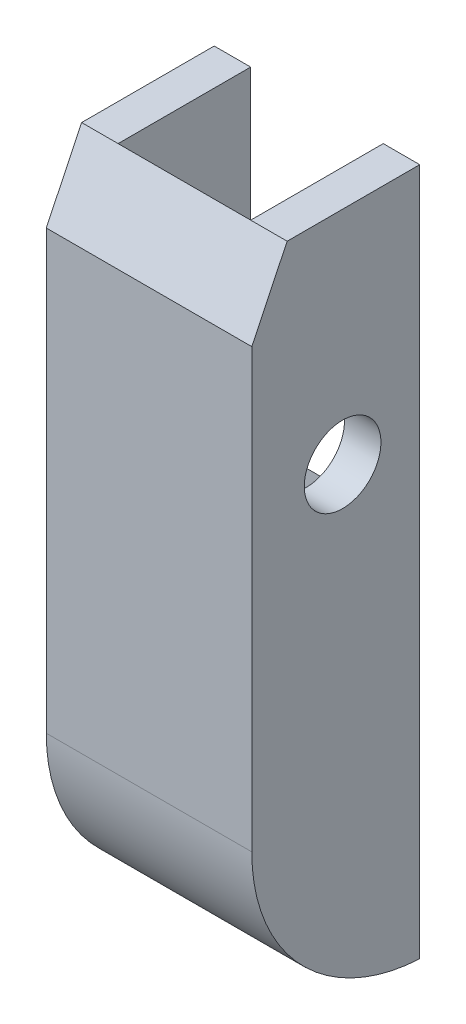
ISO-10303-21;
HEADER;
FILE_DESCRIPTION(('STEP AP214'),'2;1');
FILE_NAME('part.step','',(''),(''),'','','');
FILE_SCHEMA(('AUTOMOTIVE_DESIGN { 1 0 10303 214 1 1 1 1 }'));
ENDSEC;
DATA;
#1=APPLICATION_CONTEXT('core data for automotive mechanical design processes');
#2=APPLICATION_PROTOCOL_DEFINITION('international standard','automotive_design',2000,#1);
#3=PRODUCT_CONTEXT('',#1,'mechanical');
#4=PRODUCT('Part','Part','',(#3));
#5=PRODUCT_RELATED_PRODUCT_CATEGORY('part','',(#4));
#6=PRODUCT_DEFINITION_FORMATION('','',#4);
#7=PRODUCT_DEFINITION_CONTEXT('part definition',#1,'design');
#8=PRODUCT_DEFINITION('design','',#6,#7);
#9=PRODUCT_DEFINITION_SHAPE('','',#8);
#10=(LENGTH_UNIT() NAMED_UNIT(*) SI_UNIT(.MILLI.,.METRE.));
#11=(NAMED_UNIT(*) PLANE_ANGLE_UNIT() SI_UNIT($,.RADIAN.));
#12=(NAMED_UNIT(*) SI_UNIT($,.STERADIAN.) SOLID_ANGLE_UNIT());
#13=UNCERTAINTY_MEASURE_WITH_UNIT(LENGTH_MEASURE(1.E-05),#10,'distance_accuracy_value','');
#14=(GEOMETRIC_REPRESENTATION_CONTEXT(3) GLOBAL_UNCERTAINTY_ASSIGNED_CONTEXT((#13)) GLOBAL_UNIT_ASSIGNED_CONTEXT((#10,
#11,#12)) REPRESENTATION_CONTEXT('',''));
#15=CARTESIAN_POINT('',(0.,0.,0.));
#16=DIRECTION('',(0.,0.,1.));
#17=DIRECTION('',(1.,0.,0.));
#18=AXIS2_PLACEMENT_3D('',#15,#16,#17);
#19=CARTESIAN_POINT('',(0.,0.,7.62));
#20=DIRECTION('',(0.,0.,-1.));
#21=DIRECTION('',(-1.,0.,0.));
#22=AXIS2_PLACEMENT_3D('',#19,#20,#21);
#23=PLANE('',#22);
#24=DIRECTION('',(0.,-1.,0.));
#25=VECTOR('',#24,1.);
#26=CARTESIAN_POINT('',(9.7155,45.98924,7.62));
#27=LINE('',#26,#25);
#28=CARTESIAN_POINT('',(9.7155,39.52494,7.62));
#29=VERTEX_POINT('',#28);
#30=CARTESIAN_POINT('',(9.7155,26.82494,7.62));
#31=VERTEX_POINT('',#30);
#32=EDGE_CURVE('E188',#29,#31,#27,.T.);
#33=ORIENTED_EDGE('',*,*,#32,.T.);
#34=DIRECTION('',(1.,0.,0.));
#35=VECTOR('',#34,1.);
#36=CARTESIAN_POINT('',(-1.93222127853172,26.82494,7.62));
#37=LINE('',#36,#35);
#38=CARTESIAN_POINT('',(2.0955,26.82494,7.62));
#39=VERTEX_POINT('',#38);
#40=EDGE_CURVE('E141',#39,#31,#37,.T.);
#41=ORIENTED_EDGE('',*,*,#40,.F.);
#42=DIRECTION('',(0.,1.,0.));
#43=VECTOR('',#42,1.);
#44=CARTESIAN_POINT('',(2.0955,45.98924,7.62));
#45=LINE('',#44,#43);
#46=CARTESIAN_POINT('',(2.0955,39.52494,7.62));
#47=VERTEX_POINT('',#46);
#48=EDGE_CURVE('E146',#39,#47,#45,.T.);
#49=ORIENTED_EDGE('',*,*,#48,.T.);
#50=DIRECTION('',(-1.,0.,0.));
#51=VECTOR('',#50,1.);
#52=CARTESIAN_POINT('',(0.,39.52494,7.62));
#53=LINE('',#52,#51);
#54=EDGE_CURVE('E12',#29,#47,#53,.T.);
#55=ORIENTED_EDGE('',*,*,#54,.F.);
#56=EDGE_LOOP('',(#33,#41,#49,#55));
#57=FACE_BOUND('',#56,.T.);
#58=ADVANCED_FACE('F43',(#57),#23,.T.);
#59=CARTESIAN_POINT('',(11.811,0.,9.652));
#60=DIRECTION('',(-1.,0.,0.));
#61=DIRECTION('',(0.,0.,1.));
#62=AXIS2_PLACEMENT_3D('',#59,#60,#61);
#63=PLANE('',#62);
#64=CARTESIAN_POINT('',(11.811,26.82494,4.4323));
#65=DIRECTION('',(-1.,0.,0.));
#66=DIRECTION('',(0.,0.,1.));
#67=AXIS2_PLACEMENT_3D('',#64,#65,#66);
#68=CIRCLE('',#67,2.20345);
#69=CARTESIAN_POINT('',(11.811,26.82494,6.63575));
#70=VERTEX_POINT('',#69);
#71=EDGE_CURVE('E177',#70,#70,#68,.T.);
#72=ORIENTED_EDGE('',*,*,#71,.T.);
#73=EDGE_LOOP('',(#72));
#74=FACE_BOUND('',#73,.T.);
#75=DIRECTION('',(0.,1.,0.));
#76=VECTOR('',#75,1.);
#77=CARTESIAN_POINT('',(11.811,0.,0.));
#78=LINE('',#77,#76);
#79=CARTESIAN_POINT('',(11.811,0.,0.));
#80=VERTEX_POINT('',#79);
#81=CARTESIAN_POINT('',(11.811,39.52494,0.));
#82=VERTEX_POINT('',#81);
#83=EDGE_CURVE('E205',#80,#82,#78,.T.);
#84=ORIENTED_EDGE('',*,*,#83,.T.);
#85=DIRECTION('',(0.,0.,-1.));
#86=VECTOR('',#85,1.);
#87=CARTESIAN_POINT('',(11.811,39.52494,7.62));
#88=LINE('',#87,#86);
#89=CARTESIAN_POINT('',(11.811,39.52494,7.62));
#90=VERTEX_POINT('',#89);
#91=EDGE_CURVE('E158',#90,#82,#88,.T.);
#92=ORIENTED_EDGE('',*,*,#91,.F.);
#93=DIRECTION('',(0.,0.901435014436662,-0.432914442756967));
#94=VECTOR('',#93,1.);
#95=CARTESIAN_POINT('',(11.811,35.2938130880166,9.652));
#96=LINE('',#95,#94);
#97=CARTESIAN_POINT('',(11.811,35.2938130880166,9.652));
#98=VERTEX_POINT('',#97);
#99=EDGE_CURVE('E153',#98,#90,#96,.T.);
#100=ORIENTED_EDGE('',*,*,#99,.F.);
#101=DIRECTION('',(0.,1.,0.));
#102=VECTOR('',#101,1.);
#103=CARTESIAN_POINT('',(11.811,0.,9.652));
#104=LINE('',#103,#102);
#105=CARTESIAN_POINT('',(11.811,10.1472920525626,9.652));
#106=VERTEX_POINT('',#105);
#107=EDGE_CURVE('E196',#106,#98,#104,.T.);
#108=ORIENTED_EDGE('',*,*,#107,.F.);
#109=CARTESIAN_POINT('',(11.811,10.1472920525626,-0.508000000000002));
#110=DIRECTION('',(-1.,0.,0.));
#111=DIRECTION('',(0.,0.,1.));
#112=AXIS2_PLACEMENT_3D('',#109,#110,#111);
#113=CIRCLE('',#112,10.16);
#114=EDGE_CURVE('E214',#106,#80,#113,.F.);
#115=ORIENTED_EDGE('',*,*,#114,.T.);
#116=EDGE_LOOP('',(#84,#92,#100,#108,#115));
#117=FACE_BOUND('',#116,.T.);
#118=ADVANCED_FACE('F218',(#74,#117),#63,.F.);
#119=CARTESIAN_POINT('',(0.,0.,9.652));
#120=DIRECTION('',(-1.,0.,0.));
#121=DIRECTION('',(0.,0.,1.));
#122=AXIS2_PLACEMENT_3D('',#119,#120,#121);
#123=PLANE('',#122);
#124=DIRECTION('',(0.,0.,-1.));
#125=VECTOR('',#124,1.);
#126=CARTESIAN_POINT('',(0.,39.52494,7.62));
#127=LINE('',#126,#125);
#128=CARTESIAN_POINT('',(0.,39.52494,7.62));
#129=VERTEX_POINT('',#128);
#130=CARTESIAN_POINT('',(0.,39.52494,0.));
#131=VERTEX_POINT('',#130);
#132=EDGE_CURVE('E157',#129,#131,#127,.T.);
#133=ORIENTED_EDGE('',*,*,#132,.T.);
#134=DIRECTION('',(0.,1.,0.));
#135=VECTOR('',#134,1.);
#136=CARTESIAN_POINT('',(0.,0.,0.));
#137=LINE('',#136,#135);
#138=CARTESIAN_POINT('',(0.,0.,0.));
#139=VERTEX_POINT('',#138);
#140=EDGE_CURVE('E200',#139,#131,#137,.T.);
#141=ORIENTED_EDGE('',*,*,#140,.F.);
#142=CARTESIAN_POINT('',(0.,10.1472920525626,-0.508000000000002));
#143=DIRECTION('',(-1.,0.,0.));
#144=DIRECTION('',(0.,0.,1.));
#145=AXIS2_PLACEMENT_3D('',#142,#143,#144);
#146=CIRCLE('',#145,10.16);
#147=CARTESIAN_POINT('',(0.,10.1472920525626,9.652));
#148=VERTEX_POINT('',#147);
#149=EDGE_CURVE('E51',#139,#148,#146,.T.);
#150=ORIENTED_EDGE('',*,*,#149,.T.);
#151=DIRECTION('',(0.,1.,0.));
#152=VECTOR('',#151,1.);
#153=CARTESIAN_POINT('',(0.,0.,9.652));
#154=LINE('',#153,#152);
#155=CARTESIAN_POINT('',(0.,35.2938130880166,9.652));
#156=VERTEX_POINT('',#155);
#157=EDGE_CURVE('E199',#148,#156,#154,.T.);
#158=ORIENTED_EDGE('',*,*,#157,.T.);
#159=DIRECTION('',(0.,0.901435014436662,-0.432914442756967));
#160=VECTOR('',#159,1.);
#161=CARTESIAN_POINT('',(0.,35.2938130880166,9.652));
#162=LINE('',#161,#160);
#163=EDGE_CURVE('E154',#156,#129,#162,.T.);
#164=ORIENTED_EDGE('',*,*,#163,.T.);
#165=EDGE_LOOP('',(#133,#141,#150,#158,#164));
#166=FACE_BOUND('',#165,.T.);
#167=CARTESIAN_POINT('',(0.,26.82494,4.4323));
#168=DIRECTION('',(-1.,0.,0.));
#169=DIRECTION('',(0.,0.,1.));
#170=AXIS2_PLACEMENT_3D('',#167,#168,#169);
#171=CIRCLE('',#170,2.20345);
#172=CARTESIAN_POINT('',(0.,26.82494,6.63575));
#173=VERTEX_POINT('',#172);
#174=EDGE_CURVE('E184',#173,#173,#171,.T.);
#175=ORIENTED_EDGE('',*,*,#174,.F.);
#176=EDGE_LOOP('',(#175));
#177=FACE_BOUND('',#176,.T.);
#178=ADVANCED_FACE('F230',(#166,#177),#123,.T.);
#179=CARTESIAN_POINT('',(0.,0.,9.652));
#180=DIRECTION('',(0.,0.,1.));
#181=DIRECTION('',(1.,0.,0.));
#182=AXIS2_PLACEMENT_3D('',#179,#180,#181);
#183=PLANE('',#182);
#184=DIRECTION('',(1.,0.,0.));
#185=VECTOR('',#184,1.);
#186=CARTESIAN_POINT('',(0.,35.2938130880166,9.652));
#187=LINE('',#186,#185);
#188=EDGE_CURVE('E161',#156,#98,#187,.T.);
#189=ORIENTED_EDGE('',*,*,#188,.F.);
#190=ORIENTED_EDGE('',*,*,#157,.F.);
#191=DIRECTION('',(-1.,0.,0.));
#192=VECTOR('',#191,1.);
#193=CARTESIAN_POINT('',(11.811,10.1472920525626,9.652));
#194=LINE('',#193,#192);
#195=EDGE_CURVE('E202',#148,#106,#194,.F.);
#196=ORIENTED_EDGE('',*,*,#195,.T.);
#197=ORIENTED_EDGE('',*,*,#107,.T.);
#198=EDGE_LOOP('',(#189,#190,#196,#197));
#199=FACE_BOUND('',#198,.T.);
#200=ADVANCED_FACE('F229',(#199),#183,.T.);
#201=CARTESIAN_POINT('',(0.,0.,0.));
#202=DIRECTION('',(0.,0.,1.));
#203=DIRECTION('',(1.,0.,0.));
#204=AXIS2_PLACEMENT_3D('',#201,#202,#203);
#205=PLANE('',#204);
#206=DIRECTION('',(0.,1.,0.));
#207=VECTOR('',#206,1.);
#208=CARTESIAN_POINT('',(2.0955,45.98924,0.));
#209=LINE('',#208,#207);
#210=CARTESIAN_POINT('',(2.0955,21.1600760854083,0.));
#211=VERTEX_POINT('',#210);
#212=CARTESIAN_POINT('',(2.0955,39.52494,0.));
#213=VERTEX_POINT('',#212);
#214=EDGE_CURVE('E191',#211,#213,#209,.T.);
#215=ORIENTED_EDGE('',*,*,#214,.F.);
#216=DIRECTION('',(1.,0.,0.));
#217=VECTOR('',#216,1.);
#218=CARTESIAN_POINT('',(-3.62656346089121,21.1600760854083,0.));
#219=LINE('',#218,#217);
#220=CARTESIAN_POINT('',(9.7155,21.1600760854083,0.));
#221=VERTEX_POINT('',#220);
#222=EDGE_CURVE('E129',#211,#221,#219,.T.);
#223=ORIENTED_EDGE('',*,*,#222,.T.);
#224=DIRECTION('',(0.,-1.,0.));
#225=VECTOR('',#224,1.);
#226=CARTESIAN_POINT('',(9.7155,45.98924,0.));
#227=LINE('',#226,#225);
#228=CARTESIAN_POINT('',(9.7155,39.52494,0.));
#229=VERTEX_POINT('',#228);
#230=EDGE_CURVE('E187',#229,#221,#227,.T.);
#231=ORIENTED_EDGE('',*,*,#230,.F.);
#232=DIRECTION('',(1.,0.,0.));
#233=VECTOR('',#232,1.);
#234=CARTESIAN_POINT('',(0.,39.52494,0.));
#235=LINE('',#234,#233);
#236=EDGE_CURVE('E168',#229,#82,#235,.T.);
#237=ORIENTED_EDGE('',*,*,#236,.T.);
#238=ORIENTED_EDGE('',*,*,#83,.F.);
#239=DIRECTION('',(1.,0.,0.));
#240=VECTOR('',#239,1.);
#241=CARTESIAN_POINT('',(0.,0.,0.));
#242=LINE('',#241,#240);
#243=EDGE_CURVE('E193',#139,#80,#242,.T.);
#244=ORIENTED_EDGE('',*,*,#243,.F.);
#245=ORIENTED_EDGE('',*,*,#140,.T.);
#246=EDGE_CURVE('E164',#131,#213,#235,.T.);
#247=ORIENTED_EDGE('',*,*,#246,.T.);
#248=EDGE_LOOP('',(#215,#223,#231,#237,#238,#244,#245,#247));
#249=FACE_BOUND('',#248,.T.);
#250=ADVANCED_FACE('F225',(#249),#205,.F.);
#251=CARTESIAN_POINT('',(9.7155,45.98924,7.62));
#252=DIRECTION('',(1.,0.,0.));
#253=DIRECTION('',(0.,1.,0.));
#254=AXIS2_PLACEMENT_3D('',#251,#252,#253);
#255=PLANE('',#254);
#256=CARTESIAN_POINT('',(9.7155,26.82494,4.4323));
#257=DIRECTION('',(1.,0.,0.));
#258=DIRECTION('',(0.,1.,0.));
#259=AXIS2_PLACEMENT_3D('',#256,#257,#258);
#260=CIRCLE('',#259,2.20345);
#261=CARTESIAN_POINT('',(9.7155,29.02839,4.4323));
#262=VERTEX_POINT('',#261);
#263=EDGE_CURVE('E181',#262,#262,#260,.T.);
#264=ORIENTED_EDGE('',*,*,#263,.T.);
#265=EDGE_LOOP('',(#264));
#266=FACE_BOUND('',#265,.T.);
#267=DIRECTION('',(0.,-0.432914442756968,-0.901435014436662));
#268=VECTOR('',#267,1.);
#269=CARTESIAN_POINT('',(9.7155,17.1943622298093,-8.25759774589093));
#270=LINE('',#269,#268);
#271=CARTESIAN_POINT('',(9.7155,23.9514356044803,5.81230136917639));
#272=VERTEX_POINT('',#271);
#273=EDGE_CURVE('E133',#272,#221,#270,.T.);
#274=ORIENTED_EDGE('',*,*,#273,.F.);
#275=CARTESIAN_POINT('',(9.7155,26.82494,4.4323));
#276=DIRECTION('',(-1.,0.,0.));
#277=DIRECTION('',(0.,-1.,0.));
#278=AXIS2_PLACEMENT_3D('',#275,#276,#277);
#279=CIRCLE('',#278,3.1877);
#280=EDGE_CURVE('E140',#272,#31,#279,.T.);
#281=ORIENTED_EDGE('',*,*,#280,.T.);
#282=ORIENTED_EDGE('',*,*,#32,.F.);
#283=DIRECTION('',(0.,0.,-1.));
#284=VECTOR('',#283,1.);
#285=CARTESIAN_POINT('',(9.7155,39.52494,7.62));
#286=LINE('',#285,#284);
#287=EDGE_CURVE('E174',#29,#229,#286,.T.);
#288=ORIENTED_EDGE('',*,*,#287,.T.);
#289=ORIENTED_EDGE('',*,*,#230,.T.);
#290=EDGE_LOOP('',(#274,#281,#282,#288,#289));
#291=FACE_BOUND('',#290,.T.);
#292=ADVANCED_FACE('F238',(#266,#291),#255,.F.);
#293=CARTESIAN_POINT('',(2.0955,45.98924,7.62));
#294=DIRECTION('',(-1.,0.,0.));
#295=DIRECTION('',(0.,-1.,0.));
#296=AXIS2_PLACEMENT_3D('',#293,#294,#295);
#297=PLANE('',#296);
#298=CARTESIAN_POINT('',(2.0955,26.82494,4.4323));
#299=DIRECTION('',(-1.,0.,0.));
#300=DIRECTION('',(0.,-1.,0.));
#301=AXIS2_PLACEMENT_3D('',#298,#299,#300);
#302=CIRCLE('',#301,2.20345);
#303=CARTESIAN_POINT('',(2.0955,24.62149,4.4323));
#304=VERTEX_POINT('',#303);
#305=EDGE_CURVE('E180',#304,#304,#302,.T.);
#306=ORIENTED_EDGE('',*,*,#305,.T.);
#307=EDGE_LOOP('',(#306));
#308=FACE_BOUND('',#307,.T.);
#309=ORIENTED_EDGE('',*,*,#48,.F.);
#310=CARTESIAN_POINT('',(2.0955,26.82494,4.4323));
#311=DIRECTION('',(-1.,0.,0.));
#312=DIRECTION('',(0.,-1.,0.));
#313=AXIS2_PLACEMENT_3D('',#310,#311,#312);
#314=CIRCLE('',#313,3.1877);
#315=CARTESIAN_POINT('',(2.0955,23.9514356044803,5.81230136917639));
#316=VERTEX_POINT('',#315);
#317=EDGE_CURVE('E137',#316,#39,#314,.T.);
#318=ORIENTED_EDGE('',*,*,#317,.F.);
#319=DIRECTION('',(0.,-0.432914442756968,-0.901435014436661));
#320=VECTOR('',#319,1.);
#321=CARTESIAN_POINT('',(2.0955,17.1943622298093,-8.25759774589093));
#322=LINE('',#321,#320);
#323=EDGE_CURVE('E122',#316,#211,#322,.T.);
#324=ORIENTED_EDGE('',*,*,#323,.T.);
#325=ORIENTED_EDGE('',*,*,#214,.T.);
#326=DIRECTION('',(0.,0.,1.));
#327=VECTOR('',#326,1.);
#328=CARTESIAN_POINT('',(2.0955,39.52494,7.62));
#329=LINE('',#328,#327);
#330=EDGE_CURVE('E167',#213,#47,#329,.T.);
#331=ORIENTED_EDGE('',*,*,#330,.T.);
#332=EDGE_LOOP('',(#309,#318,#324,#325,#331));
#333=FACE_BOUND('',#332,.T.);
#334=ADVANCED_FACE('F144',(#308,#333),#297,.F.);
#335=CARTESIAN_POINT('',(11.811,26.82494,4.4323));
#336=DIRECTION('',(-1.,0.,0.));
#337=DIRECTION('',(0.,0.,1.));
#338=AXIS2_PLACEMENT_3D('',#335,#336,#337);
#339=CYLINDRICAL_SURFACE('',#338,2.20345);
#340=ORIENTED_EDGE('',*,*,#174,.T.);
#341=EDGE_LOOP('',(#340));
#342=FACE_BOUND('',#341,.T.);
#343=ORIENTED_EDGE('',*,*,#305,.F.);
#344=EDGE_LOOP('',(#343));
#345=FACE_BOUND('',#344,.T.);
#346=ADVANCED_FACE('F255',(#342,#345),#339,.F.);
#347=ORIENTED_EDGE('',*,*,#71,.F.);
#348=EDGE_LOOP('',(#347));
#349=FACE_BOUND('',#348,.T.);
#350=ORIENTED_EDGE('',*,*,#263,.F.);
#351=EDGE_LOOP('',(#350));
#352=FACE_BOUND('',#351,.T.);
#353=ADVANCED_FACE('F251',(#349,#352),#339,.F.);
#354=CARTESIAN_POINT('',(0.,10.1472920525626,-0.508000000000002));
#355=DIRECTION('',(1.,0.,0.));
#356=DIRECTION('',(0.,0.,-1.));
#357=AXIS2_PLACEMENT_3D('',#354,#355,#356);
#358=CYLINDRICAL_SURFACE('',#357,10.16);
#359=ORIENTED_EDGE('',*,*,#149,.F.);
#360=ORIENTED_EDGE('',*,*,#243,.T.);
#361=ORIENTED_EDGE('',*,*,#114,.F.);
#362=ORIENTED_EDGE('',*,*,#195,.F.);
#363=EDGE_LOOP('',(#359,#360,#361,#362));
#364=FACE_BOUND('',#363,.T.);
#365=ADVANCED_FACE('F45',(#364),#358,.T.);
#366=CARTESIAN_POINT('',(0.,39.52494,7.62));
#367=DIRECTION('',(0.,-1.,0.));
#368=DIRECTION('',(0.,0.,-1.));
#369=AXIS2_PLACEMENT_3D('',#366,#367,#368);
#370=PLANE('',#369);
#371=DIRECTION('',(1.,0.,0.));
#372=VECTOR('',#371,1.);
#373=CARTESIAN_POINT('',(0.,39.52494,7.62));
#374=LINE('',#373,#372);
#375=EDGE_CURVE('E57',#29,#90,#374,.T.);
#376=ORIENTED_EDGE('',*,*,#375,.T.);
#377=ORIENTED_EDGE('',*,*,#91,.T.);
#378=ORIENTED_EDGE('',*,*,#236,.F.);
#379=ORIENTED_EDGE('',*,*,#287,.F.);
#380=EDGE_LOOP('',(#376,#377,#378,#379));
#381=FACE_BOUND('',#380,.T.);
#382=ADVANCED_FACE('F241',(#381),#370,.F.);
#383=ORIENTED_EDGE('',*,*,#246,.F.);
#384=ORIENTED_EDGE('',*,*,#132,.F.);
#385=EDGE_CURVE('E169',#129,#47,#374,.T.);
#386=ORIENTED_EDGE('',*,*,#385,.T.);
#387=ORIENTED_EDGE('',*,*,#330,.F.);
#388=EDGE_LOOP('',(#383,#384,#386,#387));
#389=FACE_BOUND('',#388,.T.);
#390=ADVANCED_FACE('F236',(#389),#370,.F.);
#391=CARTESIAN_POINT('',(0.,35.2938130880166,9.652));
#392=DIRECTION('',(0.,-0.432914442756967,-0.901435014436662));
#393=DIRECTION('',(0.,0.901435014436662,-0.432914442756967));
#394=AXIS2_PLACEMENT_3D('',#391,#392,#393);
#395=PLANE('',#394);
#396=ORIENTED_EDGE('',*,*,#99,.T.);
#397=ORIENTED_EDGE('',*,*,#375,.F.);
#398=ORIENTED_EDGE('',*,*,#54,.T.);
#399=ORIENTED_EDGE('',*,*,#385,.F.);
#400=ORIENTED_EDGE('',*,*,#163,.F.);
#401=ORIENTED_EDGE('',*,*,#188,.T.);
#402=EDGE_LOOP('',(#396,#397,#398,#399,#400,#401));
#403=FACE_BOUND('',#402,.T.);
#404=ADVANCED_FACE('F233',(#403),#395,.F.);
#405=CARTESIAN_POINT('',(-3.62656346089121,17.1943622298093,-8.25759774589093));
#406=DIRECTION('',(0.,-0.901435014436662,0.432914442756968));
#407=DIRECTION('',(0.,-0.432914442756968,-0.901435014436662));
#408=AXIS2_PLACEMENT_3D('',#405,#406,#407);
#409=PLANE('',#408);
#410=ORIENTED_EDGE('',*,*,#323,.F.);
#411=DIRECTION('',(1.,0.,0.));
#412=VECTOR('',#411,1.);
#413=CARTESIAN_POINT('',(-1.93222127853173,23.9514356044803,5.81230136917639));
#414=LINE('',#413,#412);
#415=EDGE_CURVE('E126',#316,#272,#414,.T.);
#416=ORIENTED_EDGE('',*,*,#415,.T.);
#417=ORIENTED_EDGE('',*,*,#273,.T.);
#418=ORIENTED_EDGE('',*,*,#222,.F.);
#419=EDGE_LOOP('',(#410,#416,#417,#418));
#420=FACE_BOUND('',#419,.T.);
#421=ADVANCED_FACE('F124',(#420),#409,.F.);
#422=CARTESIAN_POINT('',(-1.93222127853172,26.82494,4.4323));
#423=DIRECTION('',(1.,0.,0.));
#424=DIRECTION('',(0.,1.,0.));
#425=AXIS2_PLACEMENT_3D('',#422,#423,#424);
#426=CYLINDRICAL_SURFACE('',#425,3.1877);
#427=ORIENTED_EDGE('',*,*,#415,.F.);
#428=ORIENTED_EDGE('',*,*,#317,.T.);
#429=ORIENTED_EDGE('',*,*,#40,.T.);
#430=ORIENTED_EDGE('',*,*,#280,.F.);
#431=EDGE_LOOP('',(#427,#428,#429,#430));
#432=FACE_BOUND('',#431,.T.);
#433=ADVANCED_FACE('F136',(#432),#426,.F.);
#434=CLOSED_SHELL('',(#58,#118,#178,#200,#250,#292,#334,#346,#353,#365,#382,#390,#404,#421,#433));
#435=MANIFOLD_SOLID_BREP('B2',#434);
#436=ADVANCED_BREP_SHAPE_REPRESENTATION('',(#18,#435),#14);
#437=SHAPE_DEFINITION_REPRESENTATION(#9,#436);
ENDSEC;
END-ISO-10303-21;
